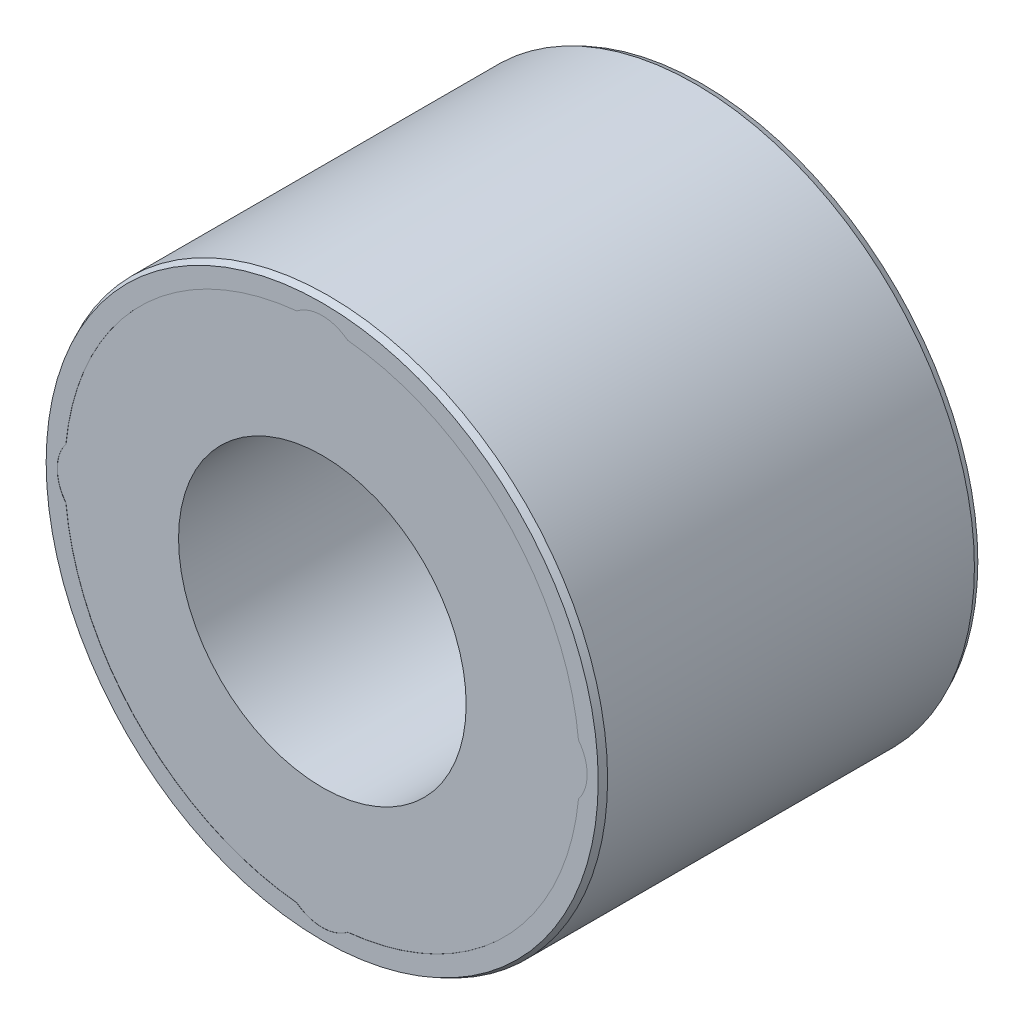
ISO-10303-21;
HEADER;
FILE_DESCRIPTION(('STEP AP214'),'2;1');
FILE_NAME('part.step','',(''),(''),'','','');
FILE_SCHEMA(('AUTOMOTIVE_DESIGN { 1 0 10303 214 1 1 1 1 }'));
ENDSEC;
DATA;
#1=APPLICATION_CONTEXT('core data for automotive mechanical design processes');
#2=APPLICATION_PROTOCOL_DEFINITION('international standard','automotive_design',2000,#1);
#3=PRODUCT_CONTEXT('',#1,'mechanical');
#4=PRODUCT('Part','Part','',(#3));
#5=PRODUCT_RELATED_PRODUCT_CATEGORY('part','',(#4));
#6=PRODUCT_DEFINITION_FORMATION('','',#4);
#7=PRODUCT_DEFINITION_CONTEXT('part definition',#1,'design');
#8=PRODUCT_DEFINITION('design','',#6,#7);
#9=PRODUCT_DEFINITION_SHAPE('','',#8);
#10=(LENGTH_UNIT() NAMED_UNIT(*) SI_UNIT(.MILLI.,.METRE.));
#11=(NAMED_UNIT(*) PLANE_ANGLE_UNIT() SI_UNIT($,.RADIAN.));
#12=(NAMED_UNIT(*) SI_UNIT($,.STERADIAN.) SOLID_ANGLE_UNIT());
#13=UNCERTAINTY_MEASURE_WITH_UNIT(LENGTH_MEASURE(1.E-05),#10,'distance_accuracy_value','');
#14=(GEOMETRIC_REPRESENTATION_CONTEXT(3) GLOBAL_UNCERTAINTY_ASSIGNED_CONTEXT((#13)) GLOBAL_UNIT_ASSIGNED_CONTEXT((#10,
#11,#12)) REPRESENTATION_CONTEXT('',''));
#15=CARTESIAN_POINT('',(0.,0.,0.));
#16=DIRECTION('',(0.,0.,1.));
#17=DIRECTION('',(1.,0.,0.));
#18=AXIS2_PLACEMENT_3D('',#15,#16,#17);
#19=CARTESIAN_POINT('',(-26.1226230415176,-56.0201458944346,-17.8799999999996));
#20=DIRECTION('',(0.,0.,1.));
#21=DIRECTION('',(0.93969262078582,0.342020143325911,0.));
#22=AXIS2_PLACEMENT_3D('',#19,#20,#21);
#23=PLANE('',#22);
#24=DIRECTION('',(0.940585088641435,0.339558081961518,0.));
#25=VECTOR('',#24,1.);
#26=CARTESIAN_POINT('',(13.3025598136243,-37.1528035100169,-17.8799999999996));
#27=LINE('',#26,#25);
#28=CARTESIAN_POINT('',(13.3025598136243,-37.1528035100169,-17.8799999999999));
#29=VERTEX_POINT('',#28);
#30=CARTESIAN_POINT('',(13.4969699059875,-37.0826200477512,-17.8799999999999));
#31=VERTEX_POINT('',#30);
#32=EDGE_CURVE('E108',#29,#31,#27,.T.);
#33=ORIENTED_EDGE('',*,*,#32,.T.);
#34=CARTESIAN_POINT('',(0.,0.,-17.8800000000001));
#35=DIRECTION('',(0.,0.,-1.));
#36=DIRECTION('',(-0.33709369182461,0.941471105734029,0.));
#37=AXIS2_PLACEMENT_3D('',#34,#35,#36);
#38=CIRCLE('',#37,39.462499999987);
#39=CARTESIAN_POINT('',(-13.3025598136243,37.1528035100169,-17.8799999999999));
#40=VERTEX_POINT('',#39);
#41=EDGE_CURVE('E100',#31,#40,#38,.F.);
#42=ORIENTED_EDGE('',*,*,#41,.T.);
#43=DIRECTION('',(-0.940585088641416,-0.339558081961569,0.));
#44=VECTOR('',#43,1.);
#45=CARTESIAN_POINT('',(-13.3025598136243,37.1528035100169,-17.8799999999996));
#46=LINE('',#45,#44);
#47=CARTESIAN_POINT('',(-13.4969699059879,37.082620047751,-17.8799999999999));
#48=VERTEX_POINT('',#47);
#49=EDGE_CURVE('E94',#40,#48,#46,.T.);
#50=ORIENTED_EDGE('',*,*,#49,.T.);
#51=CARTESIAN_POINT('',(0.,0.,-17.8800000000001));
#52=DIRECTION('',(0.,0.,-1.));
#53=DIRECTION('',(0.337093621770362,-0.941471130816947,0.));
#54=AXIS2_PLACEMENT_3D('',#51,#52,#53);
#55=CIRCLE('',#54,39.462499999987);
#56=EDGE_CURVE('E104',#48,#29,#55,.F.);
#57=ORIENTED_EDGE('',*,*,#56,.T.);
#58=EDGE_LOOP('',(#33,#42,#50,#57));
#59=FACE_BOUND('',#58,.T.);
#60=CARTESIAN_POINT('',(0.,0.,-17.879999999993));
#61=DIRECTION('',(0.,0.,1.));
#62=DIRECTION('',(1.,0.,0.));
#63=AXIS2_PLACEMENT_3D('',#60,#61,#62);
#64=CIRCLE('',#63,42.0262061880968);
#65=CARTESIAN_POINT('',(42.0262061880968,0.,-17.879999999993));
#66=VERTEX_POINT('',#65);
#67=EDGE_CURVE('E121',#66,#66,#64,.F.);
#68=ORIENTED_EDGE('',*,*,#67,.T.);
#69=EDGE_LOOP('',(#68));
#70=FACE_BOUND('',#69,.T.);
#71=ADVANCED_FACE('F17',(#59,#70),#23,.F.);
#72=CARTESIAN_POINT('',(13.2587565018759,-37.0304736455418,-17.74591660132));
#73=CARTESIAN_POINT('',(13.2579094133067,-37.0281078059601,-17.825878942901));
#74=CARTESIAN_POINT('',(13.2769787414315,-37.0813666656777,-17.8824487706676));
#75=CARTESIAN_POINT('',(13.3039335367603,-37.1566489018288,-17.8799358528477));
#76=(BOUNDED_CURVE() B_SPLINE_CURVE(3,(#72,#73,#74,#75),.UNSPECIFIED.,.F.,
.F.) B_SPLINE_CURVE_WITH_KNOTS((4,4),(0.,1.),
.UNSPECIFIED.) CURVE() GEOMETRIC_REPRESENTATION_ITEM() RATIONAL_B_SPLINE_CURVE((1.,
0.789698070619107,0.789698070619107,1.)) REPRESENTATION_ITEM(''));
#77=CARTESIAN_POINT('',(0.,0.,-17.7500000000001));
#78=DIRECTION('',(0.,0.,1.));
#79=AXIS1_PLACEMENT('',#77,#78);
#80=SURFACE_OF_REVOLUTION('',#76,#79);
#81=CARTESIAN_POINT('',(0.,0.,-17.7500000000001));
#82=DIRECTION('',(0.,0.,1.));
#83=DIRECTION('',(-0.342020143325832,0.939692620785849,0.));
#84=AXIS2_PLACEMENT_3D('',#81,#82,#83);
#85=CIRCLE('',#84,39.33249999999);
#86=CARTESIAN_POINT('',(-13.4525072873599,36.96046000705,-17.7500000000001));
#87=VERTEX_POINT('',#86);
#88=EDGE_CURVE('E124',#87,#87,#85,.T.);
#89=ORIENTED_EDGE('',*,*,#88,.T.);
#90=EDGE_LOOP('',(#89));
#91=FACE_BOUND('',#90,.T.);
#92=ORIENTED_EDGE('',*,*,#56,.F.);
#93=ORIENTED_EDGE('',*,*,#49,.F.);
#94=ORIENTED_EDGE('',*,*,#41,.F.);
#95=ORIENTED_EDGE('',*,*,#32,.F.);
#96=EDGE_LOOP('',(#92,#93,#94,#95));
#97=FACE_BOUND('',#96,.T.);
#98=ADVANCED_FACE('F112',(#91,#97),#80,.T.);
#99=CARTESIAN_POINT('',(4.67221958723378,30.9948489927028,-23.3808000000007));
#100=DIRECTION('',(0.,0.,1.));
#101=DIRECTION('',(0.342020143326337,-0.939692620785665,0.));
#102=AXIS2_PLACEMENT_3D('',#99,#100,#101);
#103=PLANE('',#102);
#104=CARTESIAN_POINT('',(5.91278914872875,30.4186631606724,-23.3808000000007));
#105=DIRECTION('',(0.,0.,-1.));
#106=DIRECTION('',(-1.,0.,0.));
#107=AXIS2_PLACEMENT_3D('',#104,#105,#106);
#108=CIRCLE('',#107,0.765999999988361);
#109=CARTESIAN_POINT('',(5.14678914874039,30.4186631606724,-23.3808000000007));
#110=VERTEX_POINT('',#109);
#111=EDGE_CURVE('E125',#110,#110,#108,.T.);
#112=ORIENTED_EDGE('',*,*,#111,.T.);
#113=EDGE_LOOP('',(#112));
#114=FACE_BOUND('',#113,.T.);
#115=ADVANCED_FACE('F220',(#114),#103,.F.);
#116=CARTESIAN_POINT('',(-0.429398287331756,31.5535670183684,-23.3808000000007));
#117=DIRECTION('',(0.,0.,1.));
#118=DIRECTION('',(0.34202014332709,-0.939692620785391,0.));
#119=AXIS2_PLACEMENT_3D('',#116,#117,#118);
#120=PLANE('',#119);
#121=CARTESIAN_POINT('',(0.811171274164231,30.977381186338,-23.3808000000007));
#122=DIRECTION('',(0.,0.,-1.));
#123=DIRECTION('',(-1.,0.,0.));
#124=AXIS2_PLACEMENT_3D('',#121,#122,#123);
#125=CIRCLE('',#124,0.765999999988952);
#126=CARTESIAN_POINT('',(0.0451712741752784,30.977381186338,-23.3808000000007));
#127=VERTEX_POINT('',#126);
#128=EDGE_CURVE('E128',#127,#127,#125,.T.);
#129=ORIENTED_EDGE('',*,*,#128,.T.);
#130=EDGE_LOOP('',(#129));
#131=FACE_BOUND('',#130,.T.);
#132=ADVANCED_FACE('F517',(#131),#120,.F.);
#133=CARTESIAN_POINT('',(-5.55326561407902,31.2626127462268,-23.3808000000007));
#134=DIRECTION('',(0.,0.,1.));
#135=DIRECTION('',(0.342020143327173,-0.939692620785361,0.));
#136=AXIS2_PLACEMENT_3D('',#133,#134,#135);
#137=PLANE('',#136);
#138=CARTESIAN_POINT('',(-4.31269605255103,30.686426914171,-23.3808000000007));
#139=DIRECTION('',(0.,0.,-1.));
#140=DIRECTION('',(-1.,0.,0.));
#141=AXIS2_PLACEMENT_3D('',#138,#139,#140);
#142=CIRCLE('',#141,0.766000000013084);
#143=CARTESIAN_POINT('',(-5.07869605256411,30.686426914171,-23.3808000000007));
#144=VERTEX_POINT('',#143);
#145=EDGE_CURVE('E131',#144,#144,#142,.T.);
#146=ORIENTED_EDGE('',*,*,#145,.T.);
#147=EDGE_LOOP('',(#146));
#148=FACE_BOUND('',#147,.T.);
#149=ADVANCED_FACE('F508',(#148),#137,.F.);
#150=CARTESIAN_POINT('',(-8.09278376836504,30.689122859503,-23.3808000000007));
#151=DIRECTION('',(0.,0.,1.));
#152=DIRECTION('',(0.342020143331234,-0.939692620783883,0.));
#153=AXIS2_PLACEMENT_3D('',#150,#151,#152);
#154=PLANE('',#153);
#155=CARTESIAN_POINT('',(-7.31370027034518,30.3275417460144,-23.3808000000007));
#156=DIRECTION('',(0.,0.,-1.));
#157=DIRECTION('',(-1.,0.,0.));
#158=AXIS2_PLACEMENT_3D('',#155,#156,#157);
#159=CIRCLE('',#158,0.406500000004176);
#160=CARTESIAN_POINT('',(-7.72020027034935,30.3275417460144,-23.3808000000007));
#161=VERTEX_POINT('',#160);
#162=EDGE_CURVE('E134',#161,#161,#159,.T.);
#163=ORIENTED_EDGE('',*,*,#162,.T.);
#164=EDGE_LOOP('',(#163));
#165=FACE_BOUND('',#164,.T.);
#166=ADVANCED_FACE('F499',(#165),#154,.F.);
#167=CARTESIAN_POINT('',(-9.12644565122764,30.3129007018396,-23.3808000000007));
#168=DIRECTION('',(0.,0.,1.));
#169=DIRECTION('',(0.342020143325686,-0.939692620785902,0.));
#170=AXIS2_PLACEMENT_3D('',#167,#168,#169);
#171=PLANE('',#170);
#172=CARTESIAN_POINT('',(-8.34736215321032,29.951319588351,-23.3808000000007));
#173=DIRECTION('',(0.,0.,-1.));
#174=DIRECTION('',(-1.,0.,0.));
#175=AXIS2_PLACEMENT_3D('',#172,#173,#174);
#176=CIRCLE('',#175,0.40650000000418);
#177=CARTESIAN_POINT('',(-8.7538621532145,29.951319588351,-23.3808000000007));
#178=VERTEX_POINT('',#177);
#179=EDGE_CURVE('E137',#178,#178,#176,.T.);
#180=ORIENTED_EDGE('',*,*,#179,.T.);
#181=EDGE_LOOP('',(#180));
#182=FACE_BOUND('',#181,.T.);
#183=ADVANCED_FACE('F491',(#182),#171,.F.);
#184=CARTESIAN_POINT('',(0.,0.,-17.879999999993));
#185=DIRECTION('',(0.,0.,1.));
#186=DIRECTION('',(1.,0.,0.));
#187=AXIS2_PLACEMENT_3D('',#184,#185,#186);
#188=CONICAL_SURFACE('',#187,42.0262061880968,0.436332256746334);
#189=ORIENTED_EDGE('',*,*,#67,.F.);
#190=EDGE_LOOP('',(#189));
#191=FACE_BOUND('',#190,.T.);
#192=CARTESIAN_POINT('',(0.,0.,-16.9036191261485));
#193=DIRECTION('',(0.,0.,1.));
#194=DIRECTION('',(-0.342020143325867,0.939692620785836,0.));
#195=AXIS2_PLACEMENT_3D('',#192,#193,#194);
#196=CIRCLE('',#195,42.4814999999916);
#197=CARTESIAN_POINT('',(-14.529528718695,39.9195520699056,-16.9036191261485));
#198=VERTEX_POINT('',#197);
#199=EDGE_CURVE('E140',#198,#198,#196,.F.);
#200=ORIENTED_EDGE('',*,*,#199,.T.);
#201=EDGE_LOOP('',(#200));
#202=FACE_BOUND('',#201,.T.);
#203=ADVANCED_FACE('F482',(#191,#202),#188,.T.);
#204=CARTESIAN_POINT('',(0.,0.,-17.7500000000001));
#205=DIRECTION('',(0.,0.,1.));
#206=DIRECTION('',(1.,0.,0.));
#207=AXIS2_PLACEMENT_3D('',#204,#205,#206);
#208=CYLINDRICAL_SURFACE('',#207,39.33249999999);
#209=ORIENTED_EDGE('',*,*,#88,.F.);
#210=EDGE_LOOP('',(#209));
#211=FACE_BOUND('',#210,.T.);
#212=CARTESIAN_POINT('',(0.,0.,-14.6499999999998));
#213=DIRECTION('',(0.,0.,1.));
#214=DIRECTION('',(1.,0.,0.));
#215=AXIS2_PLACEMENT_3D('',#212,#213,#214);
#216=CIRCLE('',#215,39.33249999999);
#217=CARTESIAN_POINT('',(39.33249999999,0.,-14.6499999999998));
#218=VERTEX_POINT('',#217);
#219=EDGE_CURVE('E141',#218,#218,#216,.T.);
#220=ORIENTED_EDGE('',*,*,#219,.T.);
#221=EDGE_LOOP('',(#220));
#222=FACE_BOUND('',#221,.T.);
#223=ADVANCED_FACE('F473',(#211,#222),#208,.F.);
#224=CARTESIAN_POINT('',(5.91278914872876,30.4186631606724,-14.6499999999998));
#225=DIRECTION('',(0.,0.,-1.));
#226=DIRECTION('',(-1.,0.,0.));
#227=AXIS2_PLACEMENT_3D('',#224,#225,#226);
#228=CYLINDRICAL_SURFACE('',#227,0.765999999988361);
#229=ORIENTED_EDGE('',*,*,#111,.F.);
#230=EDGE_LOOP('',(#229));
#231=FACE_BOUND('',#230,.T.);
#232=CARTESIAN_POINT('',(5.91278914872876,30.4186631606724,-14.6499999999998));
#233=DIRECTION('',(0.,0.,-1.));
#234=DIRECTION('',(-1.,0.,0.));
#235=AXIS2_PLACEMENT_3D('',#232,#233,#234);
#236=CIRCLE('',#235,0.765999999988361);
#237=CARTESIAN_POINT('',(5.1467891487404,30.4186631606724,-14.6499999999998));
#238=VERTEX_POINT('',#237);
#239=EDGE_CURVE('E144',#238,#238,#236,.T.);
#240=ORIENTED_EDGE('',*,*,#239,.T.);
#241=EDGE_LOOP('',(#240));
#242=FACE_BOUND('',#241,.T.);
#243=ADVANCED_FACE('F464',(#231,#242),#228,.T.);
#244=CARTESIAN_POINT('',(0.81117127416424,30.977381186338,-14.6499999999998));
#245=DIRECTION('',(0.,0.,-1.));
#246=DIRECTION('',(-1.,0.,0.));
#247=AXIS2_PLACEMENT_3D('',#244,#245,#246);
#248=CYLINDRICAL_SURFACE('',#247,0.765999999988952);
#249=ORIENTED_EDGE('',*,*,#128,.F.);
#250=EDGE_LOOP('',(#249));
#251=FACE_BOUND('',#250,.T.);
#252=CARTESIAN_POINT('',(0.81117127416424,30.977381186338,-14.6499999999998));
#253=DIRECTION('',(0.,0.,-1.));
#254=DIRECTION('',(-1.,0.,0.));
#255=AXIS2_PLACEMENT_3D('',#252,#253,#254);
#256=CIRCLE('',#255,0.765999999988952);
#257=CARTESIAN_POINT('',(0.0451712741752877,30.977381186338,-14.6499999999998));
#258=VERTEX_POINT('',#257);
#259=EDGE_CURVE('E147',#258,#258,#256,.T.);
#260=ORIENTED_EDGE('',*,*,#259,.T.);
#261=EDGE_LOOP('',(#260));
#262=FACE_BOUND('',#261,.T.);
#263=ADVANCED_FACE('F455',(#251,#262),#248,.T.);
#264=CARTESIAN_POINT('',(-4.31269605255102,30.686426914171,-14.6499999999998));
#265=DIRECTION('',(0.,0.,-1.));
#266=DIRECTION('',(-1.,0.,0.));
#267=AXIS2_PLACEMENT_3D('',#264,#265,#266);
#268=CYLINDRICAL_SURFACE('',#267,0.766000000013084);
#269=ORIENTED_EDGE('',*,*,#145,.F.);
#270=EDGE_LOOP('',(#269));
#271=FACE_BOUND('',#270,.T.);
#272=CARTESIAN_POINT('',(-4.31269605255102,30.686426914171,-14.6499999999998));
#273=DIRECTION('',(0.,0.,-1.));
#274=DIRECTION('',(-1.,0.,0.));
#275=AXIS2_PLACEMENT_3D('',#272,#273,#274);
#276=CIRCLE('',#275,0.766000000013084);
#277=CARTESIAN_POINT('',(-5.07869605256411,30.686426914171,-14.6499999999998));
#278=VERTEX_POINT('',#277);
#279=EDGE_CURVE('E150',#278,#278,#276,.T.);
#280=ORIENTED_EDGE('',*,*,#279,.T.);
#281=EDGE_LOOP('',(#280));
#282=FACE_BOUND('',#281,.T.);
#283=ADVANCED_FACE('F446',(#271,#282),#268,.T.);
#284=CARTESIAN_POINT('',(-7.31370027034516,30.3275417460144,-14.6499999999998));
#285=DIRECTION('',(0.,0.,-1.));
#286=DIRECTION('',(-1.,0.,0.));
#287=AXIS2_PLACEMENT_3D('',#284,#285,#286);
#288=CYLINDRICAL_SURFACE('',#287,0.406500000004176);
#289=ORIENTED_EDGE('',*,*,#162,.F.);
#290=EDGE_LOOP('',(#289));
#291=FACE_BOUND('',#290,.T.);
#292=CARTESIAN_POINT('',(-7.31370027034516,30.3275417460144,-14.6499999999998));
#293=DIRECTION('',(0.,0.,-1.));
#294=DIRECTION('',(-1.,0.,0.));
#295=AXIS2_PLACEMENT_3D('',#292,#293,#294);
#296=CIRCLE('',#295,0.406500000004176);
#297=CARTESIAN_POINT('',(-7.72020027034934,30.3275417460144,-14.6499999999998));
#298=VERTEX_POINT('',#297);
#299=EDGE_CURVE('E153',#298,#298,#296,.T.);
#300=ORIENTED_EDGE('',*,*,#299,.T.);
#301=EDGE_LOOP('',(#300));
#302=FACE_BOUND('',#301,.T.);
#303=ADVANCED_FACE('F437',(#291,#302),#288,.T.);
#304=CARTESIAN_POINT('',(-8.3473621532103,29.951319588351,-14.6499999999998));
#305=DIRECTION('',(0.,0.,-1.));
#306=DIRECTION('',(-1.,0.,0.));
#307=AXIS2_PLACEMENT_3D('',#304,#305,#306);
#308=CYLINDRICAL_SURFACE('',#307,0.40650000000418);
#309=ORIENTED_EDGE('',*,*,#179,.F.);
#310=EDGE_LOOP('',(#309));
#311=FACE_BOUND('',#310,.T.);
#312=CARTESIAN_POINT('',(-8.3473621532103,29.951319588351,-14.6499999999998));
#313=DIRECTION('',(0.,0.,-1.));
#314=DIRECTION('',(-1.,0.,0.));
#315=AXIS2_PLACEMENT_3D('',#312,#313,#314);
#316=CIRCLE('',#315,0.40650000000418);
#317=CARTESIAN_POINT('',(-8.75386215321448,29.951319588351,-14.6499999999998));
#318=VERTEX_POINT('',#317);
#319=EDGE_CURVE('E156',#318,#318,#316,.T.);
#320=ORIENTED_EDGE('',*,*,#319,.T.);
#321=EDGE_LOOP('',(#320));
#322=FACE_BOUND('',#321,.T.);
#323=ADVANCED_FACE('F428',(#311,#322),#308,.T.);
#324=CARTESIAN_POINT('',(0.,0.,-16.9036191261485));
#325=DIRECTION('',(0.,0.,1.));
#326=DIRECTION('',(1.,0.,0.));
#327=AXIS2_PLACEMENT_3D('',#324,#325,#326);
#328=CYLINDRICAL_SURFACE('',#327,42.4814999999916);
#329=ORIENTED_EDGE('',*,*,#199,.F.);
#330=EDGE_LOOP('',(#329));
#331=FACE_BOUND('',#330,.T.);
#332=CARTESIAN_POINT('',(0.,0.,38.9436191261671));
#333=DIRECTION('',(0.,0.,-1.));
#334=DIRECTION('',(0.342020143325777,-0.939692620785869,0.));
#335=AXIS2_PLACEMENT_3D('',#332,#333,#334);
#336=CIRCLE('',#335,42.4814999999961);
#337=CARTESIAN_POINT('',(14.5295287186927,-39.9195520699113,38.9436191261671));
#338=VERTEX_POINT('',#337);
#339=EDGE_CURVE('E159',#338,#338,#336,.T.);
#340=ORIENTED_EDGE('',*,*,#339,.T.);
#341=EDGE_LOOP('',(#340));
#342=FACE_BOUND('',#341,.T.);
#343=ADVANCED_FACE('F419',(#331,#342),#328,.T.);
#344=CARTESIAN_POINT('',(24.4482496550564,52.4294782796958,-14.6499999999998));
#345=DIRECTION('',(0.,0.,1.));
#346=DIRECTION('',(-0.93969262078588,-0.342020143325745,0.));
#347=AXIS2_PLACEMENT_3D('',#344,#345,#346);
#348=PLANE('',#347);
#349=ORIENTED_EDGE('',*,*,#319,.F.);
#350=EDGE_LOOP('',(#349));
#351=FACE_BOUND('',#350,.T.);
#352=ORIENTED_EDGE('',*,*,#299,.F.);
#353=EDGE_LOOP('',(#352));
#354=FACE_BOUND('',#353,.T.);
#355=ORIENTED_EDGE('',*,*,#279,.F.);
#356=EDGE_LOOP('',(#355));
#357=FACE_BOUND('',#356,.T.);
#358=ORIENTED_EDGE('',*,*,#259,.F.);
#359=EDGE_LOOP('',(#358));
#360=FACE_BOUND('',#359,.T.);
#361=ORIENTED_EDGE('',*,*,#239,.F.);
#362=EDGE_LOOP('',(#361));
#363=FACE_BOUND('',#362,.T.);
#364=CARTESIAN_POINT('',(0.,0.,-14.6499999999998));
#365=DIRECTION('',(0.,0.,1.));
#366=DIRECTION('',(0.,-1.,0.));
#367=AXIS2_PLACEMENT_3D('',#364,#365,#366);
#368=CIRCLE('',#367,21.8949999999987);
#369=CARTESIAN_POINT('',(0.,-21.8949999999987,-14.6499999999998));
#370=VERTEX_POINT('',#369);
#371=EDGE_CURVE('E160',#370,#370,#368,.T.);
#372=ORIENTED_EDGE('',*,*,#371,.T.);
#373=EDGE_LOOP('',(#372));
#374=FACE_BOUND('',#373,.T.);
#375=ORIENTED_EDGE('',*,*,#219,.F.);
#376=EDGE_LOOP('',(#375));
#377=FACE_BOUND('',#376,.T.);
#378=ADVANCED_FACE('F410',(#351,#354,#357,#360,#363,#374,#377),#348,.F.);
#379=CARTESIAN_POINT('',(0.,0.,39.9199999999931));
#380=DIRECTION('',(0.,0.,-1.));
#381=DIRECTION('',(-1.,0.,0.));
#382=AXIS2_PLACEMENT_3D('',#379,#380,#381);
#383=CONICAL_SURFACE('',#382,42.0262061881014,0.436332256763154);
#384=CARTESIAN_POINT('',(0.,0.,39.9199999999929));
#385=DIRECTION('',(0.,0.,-1.));
#386=DIRECTION('',(-1.,0.,0.));
#387=AXIS2_PLACEMENT_3D('',#384,#385,#386);
#388=CIRCLE('',#387,42.0262061881014);
#389=CARTESIAN_POINT('',(-42.0262061881014,0.,39.9199999999929));
#390=VERTEX_POINT('',#389);
#391=EDGE_CURVE('E163',#390,#390,#388,.T.);
#392=ORIENTED_EDGE('',*,*,#391,.T.);
#393=EDGE_LOOP('',(#392));
#394=FACE_BOUND('',#393,.T.);
#395=ORIENTED_EDGE('',*,*,#339,.F.);
#396=EDGE_LOOP('',(#395));
#397=FACE_BOUND('',#396,.T.);
#398=ADVANCED_FACE('F402',(#394,#397),#383,.T.);
#399=CARTESIAN_POINT('',(0.,33.9979,39.8945999999978));
#400=DIRECTION('',(0.,0.,1.));
#401=DIRECTION('',(1.,0.,0.));
#402=AXIS2_PLACEMENT_3D('',#399,#400,#401);
#403=CYLINDRICAL_SURFACE('',#402,6.35);
#404=CARTESIAN_POINT('',(0.,33.9979,39.8945999999978));
#405=DIRECTION('',(0.,0.,1.));
#406=DIRECTION('',(1.,0.,0.));
#407=AXIS2_PLACEMENT_3D('',#404,#405,#406);
#408=CIRCLE('',#407,6.35);
#409=CARTESIAN_POINT('',(-3.87917409881621,39.0252758871874,39.8945999999978));
#410=VERTEX_POINT('',#409);
#411=CARTESIAN_POINT('',(3.87917409881663,39.0252758871871,39.8945999999978));
#412=VERTEX_POINT('',#411);
#413=EDGE_CURVE('E186',#410,#412,#408,.F.);
#414=ORIENTED_EDGE('',*,*,#413,.T.);
#415=DIRECTION('',(0.,0.,-1.));
#416=VECTOR('',#415,1.);
#417=CARTESIAN_POINT('',(3.8791740988167,39.0252758871871,39.9072999999978));
#418=LINE('',#417,#416);
#419=CARTESIAN_POINT('',(3.87917409881662,39.0252758871871,39.9199999999978));
#420=VERTEX_POINT('',#419);
#421=EDGE_CURVE('E86',#412,#420,#418,.F.);
#422=ORIENTED_EDGE('',*,*,#421,.T.);
#423=CARTESIAN_POINT('',(0.,33.9979,39.9199999999978));
#424=DIRECTION('',(0.,0.,1.));
#425=DIRECTION('',(1.,0.,0.));
#426=AXIS2_PLACEMENT_3D('',#423,#424,#425);
#427=CIRCLE('',#426,6.35);
#428=CARTESIAN_POINT('',(-3.87917409881621,39.0252758871874,39.9199999999978));
#429=VERTEX_POINT('',#428);
#430=EDGE_CURVE('E167',#420,#429,#427,.T.);
#431=ORIENTED_EDGE('',*,*,#430,.T.);
#432=DIRECTION('',(0.,0.,-1.));
#433=VECTOR('',#432,1.);
#434=CARTESIAN_POINT('',(-3.87917409881586,39.0252758871877,39.9072999999978));
#435=LINE('',#434,#433);
#436=EDGE_CURVE('E251',#410,#429,#435,.F.);
#437=ORIENTED_EDGE('',*,*,#436,.F.);
#438=EDGE_LOOP('',(#414,#422,#431,#437));
#439=FACE_BOUND('',#438,.T.);
#440=ADVANCED_FACE('F288',(#439),#403,.F.);
#441=CARTESIAN_POINT('',(0.,0.,39.8945999999978));
#442=DIRECTION('',(0.,0.,1.));
#443=DIRECTION('',(1.,0.,0.));
#444=AXIS2_PLACEMENT_3D('',#441,#442,#443);
#445=CYLINDRICAL_SURFACE('',#444,39.2176);
#446=CARTESIAN_POINT('',(0.,0.,39.8945999999978));
#447=DIRECTION('',(0.,0.,1.));
#448=DIRECTION('',(1.,0.,0.));
#449=AXIS2_PLACEMENT_3D('',#446,#447,#448);
#450=CIRCLE('',#449,39.2176);
#451=CARTESIAN_POINT('',(39.0252758871874,3.8791740988162,39.8945999999978));
#452=VERTEX_POINT('',#451);
#453=EDGE_CURVE('E188',#412,#452,#450,.F.);
#454=ORIENTED_EDGE('',*,*,#453,.T.);
#455=DIRECTION('',(0.,0.,-1.));
#456=VECTOR('',#455,1.);
#457=CARTESIAN_POINT('',(39.0252758871877,3.87917409881586,39.9072999999978));
#458=LINE('',#457,#456);
#459=CARTESIAN_POINT('',(39.0252758871874,3.87917409881621,39.9199999999978));
#460=VERTEX_POINT('',#459);
#461=EDGE_CURVE('E255',#452,#460,#458,.F.);
#462=ORIENTED_EDGE('',*,*,#461,.T.);
#463=CARTESIAN_POINT('',(0.,0.,39.9199999999978));
#464=DIRECTION('',(0.,0.,1.));
#465=DIRECTION('',(1.,0.,0.));
#466=AXIS2_PLACEMENT_3D('',#463,#464,#465);
#467=CIRCLE('',#466,39.2176);
#468=EDGE_CURVE('E184',#460,#420,#467,.T.);
#469=ORIENTED_EDGE('',*,*,#468,.T.);
#470=ORIENTED_EDGE('',*,*,#421,.F.);
#471=EDGE_LOOP('',(#454,#462,#469,#470));
#472=FACE_BOUND('',#471,.T.);
#473=ADVANCED_FACE('F291',(#472),#445,.F.);
#474=CARTESIAN_POINT('',(33.9979,0.,39.8945999999978));
#475=DIRECTION('',(0.,0.,1.));
#476=DIRECTION('',(1.,0.,0.));
#477=AXIS2_PLACEMENT_3D('',#474,#475,#476);
#478=CYLINDRICAL_SURFACE('',#477,6.35);
#479=ORIENTED_EDGE('',*,*,#461,.F.);
#480=CARTESIAN_POINT('',(33.9979,0.,39.8945999999978));
#481=DIRECTION('',(0.,0.,1.));
#482=DIRECTION('',(1.,0.,0.));
#483=AXIS2_PLACEMENT_3D('',#480,#481,#482);
#484=CIRCLE('',#483,6.35);
#485=CARTESIAN_POINT('',(39.0252758871871,-3.87917409881662,39.8945999999978));
#486=VERTEX_POINT('',#485);
#487=EDGE_CURVE('E191',#452,#486,#484,.F.);
#488=ORIENTED_EDGE('',*,*,#487,.T.);
#489=DIRECTION('',(0.,0.,-1.));
#490=VECTOR('',#489,1.);
#491=CARTESIAN_POINT('',(39.0252758871871,-3.87917409881669,39.9072999999978));
#492=LINE('',#491,#490);
#493=CARTESIAN_POINT('',(39.0252758871871,-3.87917409881662,39.9199999999978));
#494=VERTEX_POINT('',#493);
#495=EDGE_CURVE('E257',#486,#494,#492,.F.);
#496=ORIENTED_EDGE('',*,*,#495,.T.);
#497=CARTESIAN_POINT('',(33.9979,0.,39.9199999999978));
#498=DIRECTION('',(0.,0.,1.));
#499=DIRECTION('',(1.,0.,0.));
#500=AXIS2_PLACEMENT_3D('',#497,#498,#499);
#501=CIRCLE('',#500,6.35);
#502=EDGE_CURVE('E181',#494,#460,#501,.T.);
#503=ORIENTED_EDGE('',*,*,#502,.T.);
#504=EDGE_LOOP('',(#479,#488,#496,#503));
#505=FACE_BOUND('',#504,.T.);
#506=ADVANCED_FACE('F294',(#505),#478,.F.);
#507=CARTESIAN_POINT('',(0.,0.,39.8945999999978));
#508=DIRECTION('',(0.,0.,1.));
#509=DIRECTION('',(1.,0.,0.));
#510=AXIS2_PLACEMENT_3D('',#507,#508,#509);
#511=CYLINDRICAL_SURFACE('',#510,39.2176);
#512=CARTESIAN_POINT('',(0.,0.,39.8945999999978));
#513=DIRECTION('',(0.,0.,1.));
#514=DIRECTION('',(1.,0.,0.));
#515=AXIS2_PLACEMENT_3D('',#512,#513,#514);
#516=CIRCLE('',#515,39.2176);
#517=CARTESIAN_POINT('',(3.8791740988162,-39.0252758871874,39.8945999999978));
#518=VERTEX_POINT('',#517);
#519=EDGE_CURVE('E193',#486,#518,#516,.F.);
#520=ORIENTED_EDGE('',*,*,#519,.T.);
#521=DIRECTION('',(0.,0.,-1.));
#522=VECTOR('',#521,1.);
#523=CARTESIAN_POINT('',(3.87917409881586,-39.0252758871877,39.9072999999978));
#524=LINE('',#523,#522);
#525=CARTESIAN_POINT('',(3.8791740988162,-39.0252758871874,39.9199999999978));
#526=VERTEX_POINT('',#525);
#527=EDGE_CURVE('E260',#518,#526,#524,.F.);
#528=ORIENTED_EDGE('',*,*,#527,.T.);
#529=CARTESIAN_POINT('',(0.,0.,39.9199999999978));
#530=DIRECTION('',(0.,0.,1.));
#531=DIRECTION('',(1.,0.,0.));
#532=AXIS2_PLACEMENT_3D('',#529,#530,#531);
#533=CIRCLE('',#532,39.2176);
#534=EDGE_CURVE('E178',#526,#494,#533,.T.);
#535=ORIENTED_EDGE('',*,*,#534,.T.);
#536=ORIENTED_EDGE('',*,*,#495,.F.);
#537=EDGE_LOOP('',(#520,#528,#535,#536));
#538=FACE_BOUND('',#537,.T.);
#539=ADVANCED_FACE('F297',(#538),#511,.F.);
#540=CARTESIAN_POINT('',(0.,-33.9979,39.8945999999978));
#541=DIRECTION('',(0.,0.,1.));
#542=DIRECTION('',(1.,0.,0.));
#543=AXIS2_PLACEMENT_3D('',#540,#541,#542);
#544=CYLINDRICAL_SURFACE('',#543,6.35);
#545=CARTESIAN_POINT('',(0.,-33.9979,39.8945999999978));
#546=DIRECTION('',(0.,0.,1.));
#547=DIRECTION('',(1.,0.,0.));
#548=AXIS2_PLACEMENT_3D('',#545,#546,#547);
#549=CIRCLE('',#548,6.35);
#550=CARTESIAN_POINT('',(-3.87917409881664,-39.0252758871871,39.8945999999978));
#551=VERTEX_POINT('',#550);
#552=EDGE_CURVE('E195',#518,#551,#549,.F.);
#553=ORIENTED_EDGE('',*,*,#552,.T.);
#554=DIRECTION('',(0.,0.,-1.));
#555=VECTOR('',#554,1.);
#556=CARTESIAN_POINT('',(-3.87917409881672,-39.0252758871871,39.9072999999978));
#557=LINE('',#556,#555);
#558=CARTESIAN_POINT('',(-3.87917409881663,-39.0252758871871,39.9199999999978));
#559=VERTEX_POINT('',#558);
#560=EDGE_CURVE('E262',#551,#559,#557,.F.);
#561=ORIENTED_EDGE('',*,*,#560,.T.);
#562=CARTESIAN_POINT('',(0.,-33.9979,39.9199999999978));
#563=DIRECTION('',(0.,0.,1.));
#564=DIRECTION('',(1.,0.,0.));
#565=AXIS2_PLACEMENT_3D('',#562,#563,#564);
#566=CIRCLE('',#565,6.35);
#567=EDGE_CURVE('E175',#559,#526,#566,.T.);
#568=ORIENTED_EDGE('',*,*,#567,.T.);
#569=ORIENTED_EDGE('',*,*,#527,.F.);
#570=EDGE_LOOP('',(#553,#561,#568,#569));
#571=FACE_BOUND('',#570,.T.);
#572=ADVANCED_FACE('F280',(#571),#544,.F.);
#573=CARTESIAN_POINT('',(0.,0.,39.8945999999978));
#574=DIRECTION('',(0.,0.,1.));
#575=DIRECTION('',(1.,0.,0.));
#576=AXIS2_PLACEMENT_3D('',#573,#574,#575);
#577=CYLINDRICAL_SURFACE('',#576,39.2176);
#578=CARTESIAN_POINT('',(0.,0.,39.8945999999978));
#579=DIRECTION('',(0.,0.,1.));
#580=DIRECTION('',(1.,0.,0.));
#581=AXIS2_PLACEMENT_3D('',#578,#579,#580);
#582=CIRCLE('',#581,39.2176);
#583=CARTESIAN_POINT('',(-39.0252758871874,-3.8791740988162,39.8945999999978));
#584=VERTEX_POINT('',#583);
#585=EDGE_CURVE('E197',#551,#584,#582,.F.);
#586=ORIENTED_EDGE('',*,*,#585,.T.);
#587=DIRECTION('',(0.,0.,-1.));
#588=VECTOR('',#587,1.);
#589=CARTESIAN_POINT('',(-39.0252758871877,-3.87917409881586,39.9072999999978));
#590=LINE('',#589,#588);
#591=CARTESIAN_POINT('',(-39.0252758871874,-3.87917409881621,39.9199999999978));
#592=VERTEX_POINT('',#591);
#593=EDGE_CURVE('E164',#584,#592,#590,.F.);
#594=ORIENTED_EDGE('',*,*,#593,.T.);
#595=CARTESIAN_POINT('',(0.,0.,39.9199999999978));
#596=DIRECTION('',(0.,0.,1.));
#597=DIRECTION('',(1.,0.,0.));
#598=AXIS2_PLACEMENT_3D('',#595,#596,#597);
#599=CIRCLE('',#598,39.2176);
#600=EDGE_CURVE('E172',#592,#559,#599,.T.);
#601=ORIENTED_EDGE('',*,*,#600,.T.);
#602=ORIENTED_EDGE('',*,*,#560,.F.);
#603=EDGE_LOOP('',(#586,#594,#601,#602));
#604=FACE_BOUND('',#603,.T.);
#605=ADVANCED_FACE('F267',(#604),#577,.F.);
#606=CARTESIAN_POINT('',(-33.9979,0.,39.8945999999978));
#607=DIRECTION('',(0.,0.,1.));
#608=DIRECTION('',(1.,0.,0.));
#609=AXIS2_PLACEMENT_3D('',#606,#607,#608);
#610=CYLINDRICAL_SURFACE('',#609,6.35);
#611=ORIENTED_EDGE('',*,*,#593,.F.);
#612=CARTESIAN_POINT('',(-33.9979,0.,39.8945999999978));
#613=DIRECTION('',(0.,0.,1.));
#614=DIRECTION('',(1.,0.,0.));
#615=AXIS2_PLACEMENT_3D('',#612,#613,#614);
#616=CIRCLE('',#615,6.35);
#617=CARTESIAN_POINT('',(-39.0252758871874,3.87917409881621,39.8945999999978));
#618=VERTEX_POINT('',#617);
#619=EDGE_CURVE('E200',#584,#618,#616,.F.);
#620=ORIENTED_EDGE('',*,*,#619,.T.);
#621=DIRECTION('',(0.,0.,1.));
#622=VECTOR('',#621,1.);
#623=CARTESIAN_POINT('',(-39.0252758871877,3.87917409881586,39.9072999999978));
#624=LINE('',#623,#622);
#625=CARTESIAN_POINT('',(-39.0252758871874,3.87917409881621,39.9199999999978));
#626=VERTEX_POINT('',#625);
#627=EDGE_CURVE('E38',#626,#618,#624,.F.);
#628=ORIENTED_EDGE('',*,*,#627,.F.);
#629=CARTESIAN_POINT('',(-33.9979,0.,39.9199999999978));
#630=DIRECTION('',(0.,0.,1.));
#631=DIRECTION('',(1.,0.,0.));
#632=AXIS2_PLACEMENT_3D('',#629,#630,#631);
#633=CIRCLE('',#632,6.35);
#634=EDGE_CURVE('E169',#626,#592,#633,.T.);
#635=ORIENTED_EDGE('',*,*,#634,.T.);
#636=EDGE_LOOP('',(#611,#620,#628,#635));
#637=FACE_BOUND('',#636,.T.);
#638=ADVANCED_FACE('F273',(#637),#610,.F.);
#639=CARTESIAN_POINT('',(0.,0.,-14.6499999999998));
#640=DIRECTION('',(0.,0.,1.));
#641=DIRECTION('',(0.,-1.,0.));
#642=AXIS2_PLACEMENT_3D('',#639,#640,#641);
#643=CYLINDRICAL_SURFACE('',#642,21.8949999999987);
#644=ORIENTED_EDGE('',*,*,#371,.F.);
#645=EDGE_LOOP('',(#644));
#646=FACE_BOUND('',#645,.T.);
#647=CARTESIAN_POINT('',(0.,0.,39.8945999999978));
#648=DIRECTION('',(0.,0.,1.));
#649=DIRECTION('',(0.,-1.,0.));
#650=AXIS2_PLACEMENT_3D('',#647,#648,#649);
#651=CIRCLE('',#650,21.8949999999987);
#652=CARTESIAN_POINT('',(0.,-21.8949999999987,39.8945999999978));
#653=VERTEX_POINT('',#652);
#654=EDGE_CURVE('E202',#653,#653,#651,.T.);
#655=ORIENTED_EDGE('',*,*,#654,.T.);
#656=EDGE_LOOP('',(#655));
#657=FACE_BOUND('',#656,.T.);
#658=ADVANCED_FACE('F314',(#646,#657),#643,.F.);
#659=CARTESIAN_POINT('',(-26.12262304167,-56.0201458944854,39.9199999999978));
#660=DIRECTION('',(0.,0.,1.));
#661=DIRECTION('',(0.939692620785821,0.34202014332591,0.));
#662=AXIS2_PLACEMENT_3D('',#659,#660,#661);
#663=PLANE('',#662);
#664=ORIENTED_EDGE('',*,*,#502,.F.);
#665=ORIENTED_EDGE('',*,*,#534,.F.);
#666=ORIENTED_EDGE('',*,*,#567,.F.);
#667=ORIENTED_EDGE('',*,*,#600,.F.);
#668=ORIENTED_EDGE('',*,*,#634,.F.);
#669=CARTESIAN_POINT('',(0.,0.,39.9199999999978));
#670=DIRECTION('',(0.,0.,1.));
#671=DIRECTION('',(1.,0.,0.));
#672=AXIS2_PLACEMENT_3D('',#669,#670,#671);
#673=CIRCLE('',#672,39.2176);
#674=EDGE_CURVE('E29',#626,#429,#673,.F.);
#675=ORIENTED_EDGE('',*,*,#674,.T.);
#676=ORIENTED_EDGE('',*,*,#430,.F.);
#677=ORIENTED_EDGE('',*,*,#468,.F.);
#678=EDGE_LOOP('',(#664,#665,#666,#667,#668,#675,#676,#677));
#679=FACE_BOUND('',#678,.T.);
#680=ORIENTED_EDGE('',*,*,#391,.F.);
#681=EDGE_LOOP('',(#680));
#682=FACE_BOUND('',#681,.T.);
#683=ADVANCED_FACE('F275',(#679,#682),#663,.T.);
#684=CARTESIAN_POINT('',(-41.961816,-41.9617998394786,39.8945999999978));
#685=DIRECTION('',(0.,0.,1.));
#686=DIRECTION('',(1.,0.,0.));
#687=AXIS2_PLACEMENT_3D('',#684,#685,#686);
#688=PLANE('',#687);
#689=ORIENTED_EDGE('',*,*,#654,.F.);
#690=EDGE_LOOP('',(#689));
#691=FACE_BOUND('',#690,.T.);
#692=ORIENTED_EDGE('',*,*,#619,.F.);
#693=ORIENTED_EDGE('',*,*,#585,.F.);
#694=ORIENTED_EDGE('',*,*,#552,.F.);
#695=ORIENTED_EDGE('',*,*,#519,.F.);
#696=ORIENTED_EDGE('',*,*,#487,.F.);
#697=ORIENTED_EDGE('',*,*,#453,.F.);
#698=ORIENTED_EDGE('',*,*,#413,.F.);
#699=CARTESIAN_POINT('',(0.,0.,39.8945999999978));
#700=DIRECTION('',(0.,0.,1.));
#701=DIRECTION('',(1.,0.,0.));
#702=AXIS2_PLACEMENT_3D('',#699,#700,#701);
#703=CIRCLE('',#702,39.2176);
#704=EDGE_CURVE('E11',#410,#618,#703,.T.);
#705=ORIENTED_EDGE('',*,*,#704,.T.);
#706=EDGE_LOOP('',(#692,#693,#694,#695,#696,#697,#698,#705));
#707=FACE_BOUND('',#706,.T.);
#708=ADVANCED_FACE('F19',(#691,#707),#688,.T.);
#709=CARTESIAN_POINT('',(0.,0.,39.8945999999978));
#710=DIRECTION('',(0.,0.,1.));
#711=DIRECTION('',(1.,0.,0.));
#712=AXIS2_PLACEMENT_3D('',#709,#710,#711);
#713=CYLINDRICAL_SURFACE('',#712,39.2176);
#714=ORIENTED_EDGE('',*,*,#704,.F.);
#715=ORIENTED_EDGE('',*,*,#436,.T.);
#716=ORIENTED_EDGE('',*,*,#674,.F.);
#717=ORIENTED_EDGE('',*,*,#627,.T.);
#718=EDGE_LOOP('',(#714,#715,#716,#717));
#719=FACE_BOUND('',#718,.T.);
#720=ADVANCED_FACE('F286',(#719),#713,.F.);
#721=CLOSED_SHELL('',(#71,#98,#115,#132,#149,#166,#183,#203,#223,#243,#263,#283,#303,#323,#343,
#378,#398,#440,#473,#506,#539,#572,#605,#638,#658,#683,#708,#720));
#722=MANIFOLD_SOLID_BREP('B1',#721);
#723=ADVANCED_BREP_SHAPE_REPRESENTATION('',(#18,#722),#14);
#724=SHAPE_DEFINITION_REPRESENTATION(#9,#723);
ENDSEC;
END-ISO-10303-21;
